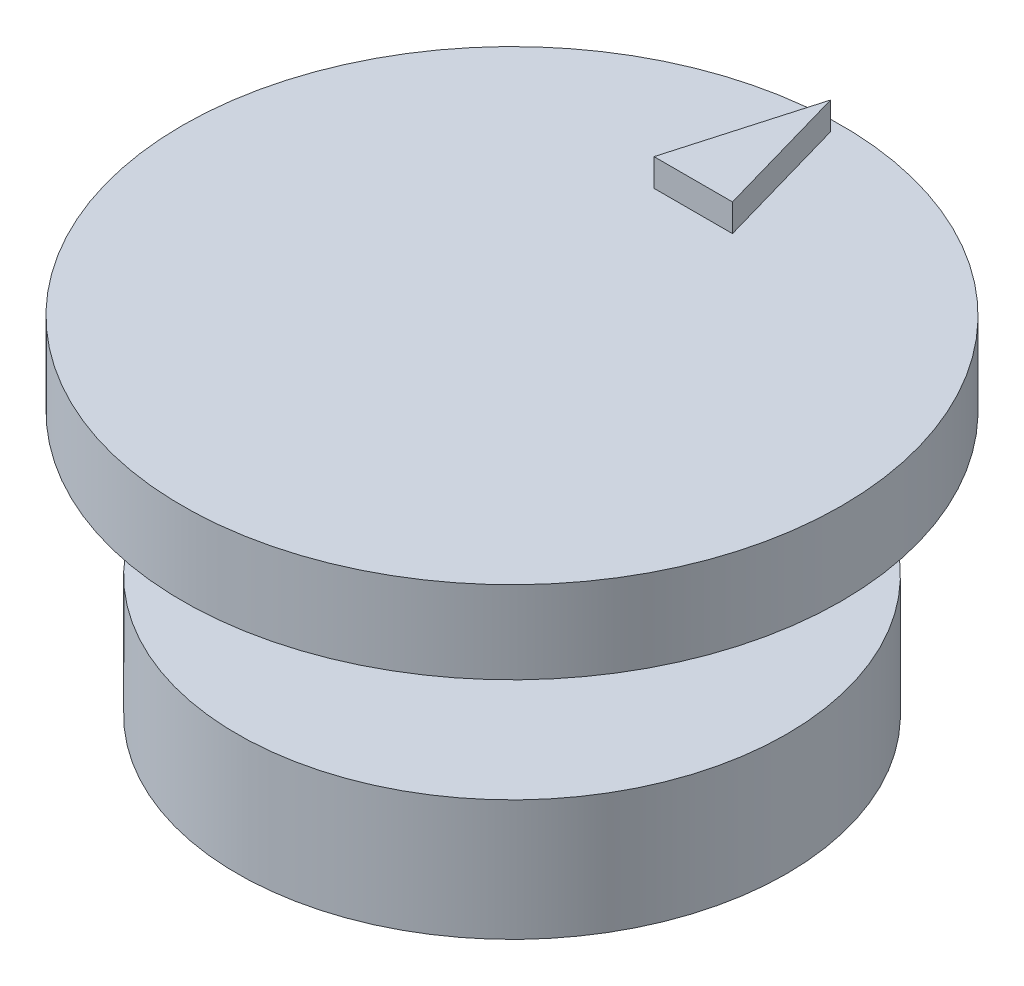
ISO-10303-21;
HEADER;
FILE_DESCRIPTION(('STEP AP214'),'2;1');
FILE_NAME('part.step','',(''),(''),'','','');
FILE_SCHEMA(('AUTOMOTIVE_DESIGN { 1 0 10303 214 1 1 1 1 }'));
ENDSEC;
DATA;
#1=APPLICATION_CONTEXT('core data for automotive mechanical design processes');
#2=APPLICATION_PROTOCOL_DEFINITION('international standard','automotive_design',2000,#1);
#3=PRODUCT_CONTEXT('',#1,'mechanical');
#4=PRODUCT('Part','Part','',(#3));
#5=PRODUCT_RELATED_PRODUCT_CATEGORY('part','',(#4));
#6=PRODUCT_DEFINITION_FORMATION('','',#4);
#7=PRODUCT_DEFINITION_CONTEXT('part definition',#1,'design');
#8=PRODUCT_DEFINITION('design','',#6,#7);
#9=PRODUCT_DEFINITION_SHAPE('','',#8);
#10=(LENGTH_UNIT() NAMED_UNIT(*) SI_UNIT(.MILLI.,.METRE.));
#11=(NAMED_UNIT(*) PLANE_ANGLE_UNIT() SI_UNIT($,.RADIAN.));
#12=(NAMED_UNIT(*) SI_UNIT($,.STERADIAN.) SOLID_ANGLE_UNIT());
#13=UNCERTAINTY_MEASURE_WITH_UNIT(LENGTH_MEASURE(1.E-05),#10,'distance_accuracy_value','');
#14=(GEOMETRIC_REPRESENTATION_CONTEXT(3) GLOBAL_UNCERTAINTY_ASSIGNED_CONTEXT((#13)) GLOBAL_UNIT_ASSIGNED_CONTEXT((#10,
#11,#12)) REPRESENTATION_CONTEXT('',''));
#15=CARTESIAN_POINT('',(0.,0.,0.));
#16=DIRECTION('',(0.,0.,1.));
#17=DIRECTION('',(1.,0.,0.));
#18=AXIS2_PLACEMENT_3D('',#15,#16,#17);
#19=CARTESIAN_POINT('',(0.,-36.8930584239754,0.));
#20=DIRECTION('',(0.,1.,0.));
#21=DIRECTION('',(-1.,0.,0.));
#22=AXIS2_PLACEMENT_3D('',#19,#20,#21);
#23=PLANE('',#22);
#24=CARTESIAN_POINT('',(0.,-36.8930584239754,0.));
#25=DIRECTION('',(0.,1.,0.));
#26=DIRECTION('',(-1.,0.,0.));
#27=AXIS2_PLACEMENT_3D('',#24,#25,#26);
#28=CIRCLE('',#27,12.7);
#29=CARTESIAN_POINT('',(-2.4106114433135,-36.8930584239754,-12.4691199556892));
#30=VERTEX_POINT('',#29);
#31=CARTESIAN_POINT('',(2.4106114433135,-36.8930584239754,-12.4691199556892));
#32=VERTEX_POINT('',#31);
#33=EDGE_CURVE('E137',#30,#32,#28,.T.);
#34=ORIENTED_EDGE('',*,*,#33,.F.);
#35=CARTESIAN_POINT('',(0.,-36.8930584239754,-9.85491099897473));
#36=DIRECTION('',(0.,1.,0.));
#37=DIRECTION('',(-1.,0.,0.));
#38=AXIS2_PLACEMENT_3D('',#35,#36,#37);
#39=CIRCLE('',#38,3.556);
#40=EDGE_CURVE('E11',#30,#32,#39,.T.);
#41=ORIENTED_EDGE('',*,*,#40,.T.);
#42=EDGE_LOOP('',(#34,#41));
#43=FACE_BOUND('',#42,.T.);
#44=ADVANCED_FACE('F35',(#43),#23,.F.);
#45=CARTESIAN_POINT('',(15.24,-20.8910584239754,0.));
#46=DIRECTION('',(0.,-1.,0.));
#47=DIRECTION('',(1.,0.,0.));
#48=AXIS2_PLACEMENT_3D('',#45,#46,#47);
#49=PLANE('',#48);
#50=CARTESIAN_POINT('',(0.,-20.8910584239754,0.));
#51=DIRECTION('',(0.,1.,0.));
#52=DIRECTION('',(-1.,0.,0.));
#53=AXIS2_PLACEMENT_3D('',#50,#51,#52);
#54=CIRCLE('',#53,15.24);
#55=CARTESIAN_POINT('',(-15.24,-20.8910584239754,0.));
#56=VERTEX_POINT('',#55);
#57=EDGE_CURVE('E111',#56,#56,#54,.T.);
#58=ORIENTED_EDGE('',*,*,#57,.T.);
#59=EDGE_LOOP('',(#58));
#60=FACE_BOUND('',#59,.T.);
#61=DIRECTION('',(-0.274670324174725,0.,-0.961538461538461));
#62=VECTOR('',#61,1.);
#63=CARTESIAN_POINT('',(1.81392282084988,-20.8910584239754,-8.382));
#64=LINE('',#63,#62);
#65=CARTESIAN_POINT('',(1.81392282084988,-20.8910584239754,-8.382));
#66=VERTEX_POINT('',#65);
#67=CARTESIAN_POINT('',(0.,-20.8910584239754,-14.732));
#68=VERTEX_POINT('',#67);
#69=EDGE_CURVE('E110',#66,#68,#64,.T.);
#70=ORIENTED_EDGE('',*,*,#69,.F.);
#71=DIRECTION('',(1.,0.,0.));
#72=VECTOR('',#71,1.);
#73=CARTESIAN_POINT('',(-1.81392282084988,-20.8910584239754,-8.382));
#74=LINE('',#73,#72);
#75=CARTESIAN_POINT('',(-1.81392282084988,-20.8910584239754,-8.382));
#76=VERTEX_POINT('',#75);
#77=EDGE_CURVE('E107',#76,#66,#74,.T.);
#78=ORIENTED_EDGE('',*,*,#77,.F.);
#79=DIRECTION('',(-0.274670324174725,0.,0.961538461538461));
#80=VECTOR('',#79,1.);
#81=CARTESIAN_POINT('',(0.,-20.8910584239754,-14.732));
#82=LINE('',#81,#80);
#83=EDGE_CURVE('E185',#68,#76,#82,.T.);
#84=ORIENTED_EDGE('',*,*,#83,.F.);
#85=EDGE_LOOP('',(#70,#78,#84));
#86=FACE_BOUND('',#85,.T.);
#87=ADVANCED_FACE('F157',(#60,#86),#49,.F.);
#88=CARTESIAN_POINT('',(0.,-20.8910584239754,0.));
#89=DIRECTION('',(0.,1.,0.));
#90=DIRECTION('',(-1.,0.,0.));
#91=AXIS2_PLACEMENT_3D('',#88,#89,#90);
#92=CYLINDRICAL_SURFACE('',#91,12.7);
#93=CARTESIAN_POINT('',(0.,-31.3050584239754,0.));
#94=DIRECTION('',(0.,1.,0.));
#95=DIRECTION('',(-1.,0.,0.));
#96=AXIS2_PLACEMENT_3D('',#93,#94,#95);
#97=CIRCLE('',#96,12.7);
#98=CARTESIAN_POINT('',(-12.7,-31.3050584239754,0.));
#99=VERTEX_POINT('',#98);
#100=EDGE_CURVE('E134',#99,#99,#97,.T.);
#101=ORIENTED_EDGE('',*,*,#100,.F.);
#102=EDGE_LOOP('',(#101));
#103=FACE_BOUND('',#102,.T.);
#104=EDGE_CURVE('E138',#32,#30,#28,.T.);
#105=ORIENTED_EDGE('',*,*,#104,.T.);
#106=ORIENTED_EDGE('',*,*,#33,.T.);
#107=EDGE_LOOP('',(#105,#106));
#108=FACE_BOUND('',#107,.T.);
#109=ADVANCED_FACE('F167',(#103,#108),#92,.T.);
#110=CARTESIAN_POINT('',(12.7,-31.3050584239754,0.));
#111=DIRECTION('',(0.,-1.,0.));
#112=DIRECTION('',(1.,0.,0.));
#113=AXIS2_PLACEMENT_3D('',#110,#111,#112);
#114=PLANE('',#113);
#115=CARTESIAN_POINT('',(0.,-31.3050584239754,0.));
#116=DIRECTION('',(0.,1.,0.));
#117=DIRECTION('',(-1.,0.,0.));
#118=AXIS2_PLACEMENT_3D('',#115,#116,#117);
#119=CIRCLE('',#118,3.175);
#120=CARTESIAN_POINT('',(-3.175,-31.3050584239754,0.));
#121=VERTEX_POINT('',#120);
#122=EDGE_CURVE('E131',#121,#121,#119,.T.);
#123=ORIENTED_EDGE('',*,*,#122,.F.);
#124=EDGE_LOOP('',(#123));
#125=FACE_BOUND('',#124,.T.);
#126=ORIENTED_EDGE('',*,*,#100,.T.);
#127=EDGE_LOOP('',(#126));
#128=FACE_BOUND('',#127,.T.);
#129=ADVANCED_FACE('F201',(#125,#128),#114,.F.);
#130=CARTESIAN_POINT('',(0.,-20.8910584239754,0.));
#131=DIRECTION('',(0.,1.,0.));
#132=DIRECTION('',(-1.,0.,0.));
#133=AXIS2_PLACEMENT_3D('',#130,#131,#132);
#134=CYLINDRICAL_SURFACE('',#133,3.175);
#135=CARTESIAN_POINT('',(0.,-26.2250584239754,0.));
#136=DIRECTION('',(0.,1.,0.));
#137=DIRECTION('',(-1.,0.,0.));
#138=AXIS2_PLACEMENT_3D('',#135,#136,#137);
#139=CIRCLE('',#138,3.175);
#140=CARTESIAN_POINT('',(-3.175,-26.2250584239754,0.));
#141=VERTEX_POINT('',#140);
#142=EDGE_CURVE('E128',#141,#141,#139,.T.);
#143=ORIENTED_EDGE('',*,*,#142,.F.);
#144=EDGE_LOOP('',(#143));
#145=FACE_BOUND('',#144,.T.);
#146=ORIENTED_EDGE('',*,*,#122,.T.);
#147=EDGE_LOOP('',(#146));
#148=FACE_BOUND('',#147,.T.);
#149=ADVANCED_FACE('F227',(#145,#148),#134,.T.);
#150=CARTESIAN_POINT('',(3.175,-26.2250584239754,0.));
#151=DIRECTION('',(0.,1.,0.));
#152=DIRECTION('',(-1.,0.,0.));
#153=AXIS2_PLACEMENT_3D('',#150,#151,#152);
#154=PLANE('',#153);
#155=CARTESIAN_POINT('',(0.,-26.2250584239754,0.));
#156=DIRECTION('',(0.,1.,0.));
#157=DIRECTION('',(-1.,0.,0.));
#158=AXIS2_PLACEMENT_3D('',#155,#156,#157);
#159=CIRCLE('',#158,12.7);
#160=CARTESIAN_POINT('',(-12.7,-26.2250584239754,0.));
#161=VERTEX_POINT('',#160);
#162=EDGE_CURVE('E125',#161,#161,#159,.T.);
#163=ORIENTED_EDGE('',*,*,#162,.F.);
#164=EDGE_LOOP('',(#163));
#165=FACE_BOUND('',#164,.T.);
#166=ORIENTED_EDGE('',*,*,#142,.T.);
#167=EDGE_LOOP('',(#166));
#168=FACE_BOUND('',#167,.T.);
#169=ADVANCED_FACE('F221',(#165,#168),#154,.F.);
#170=CARTESIAN_POINT('',(0.,-20.8910584239754,0.));
#171=DIRECTION('',(0.,1.,0.));
#172=DIRECTION('',(-1.,0.,0.));
#173=AXIS2_PLACEMENT_3D('',#170,#171,#172);
#174=CYLINDRICAL_SURFACE('',#173,12.7);
#175=CARTESIAN_POINT('',(0.,-24.7010584239754,0.));
#176=DIRECTION('',(0.,1.,0.));
#177=DIRECTION('',(-1.,0.,0.));
#178=AXIS2_PLACEMENT_3D('',#175,#176,#177);
#179=CIRCLE('',#178,12.7);
#180=CARTESIAN_POINT('',(-12.7,-24.7010584239754,0.));
#181=VERTEX_POINT('',#180);
#182=EDGE_CURVE('E122',#181,#181,#179,.T.);
#183=ORIENTED_EDGE('',*,*,#182,.F.);
#184=EDGE_LOOP('',(#183));
#185=FACE_BOUND('',#184,.T.);
#186=ORIENTED_EDGE('',*,*,#162,.T.);
#187=EDGE_LOOP('',(#186));
#188=FACE_BOUND('',#187,.T.);
#189=ADVANCED_FACE('F215',(#185,#188),#174,.T.);
#190=CARTESIAN_POINT('',(12.7,-24.7010584239754,0.));
#191=DIRECTION('',(0.,1.,0.));
#192=DIRECTION('',(-1.,0.,0.));
#193=AXIS2_PLACEMENT_3D('',#190,#191,#192);
#194=PLANE('',#193);
#195=CARTESIAN_POINT('',(0.,-24.7010584239754,0.));
#196=DIRECTION('',(0.,1.,0.));
#197=DIRECTION('',(-1.,0.,0.));
#198=AXIS2_PLACEMENT_3D('',#195,#196,#197);
#199=CIRCLE('',#198,15.24);
#200=CARTESIAN_POINT('',(-15.24,-24.7010584239754,0.));
#201=VERTEX_POINT('',#200);
#202=EDGE_CURVE('E114',#201,#201,#199,.T.);
#203=ORIENTED_EDGE('',*,*,#202,.F.);
#204=EDGE_LOOP('',(#203));
#205=FACE_BOUND('',#204,.T.);
#206=ORIENTED_EDGE('',*,*,#182,.T.);
#207=EDGE_LOOP('',(#206));
#208=FACE_BOUND('',#207,.T.);
#209=ADVANCED_FACE('F209',(#205,#208),#194,.F.);
#210=CARTESIAN_POINT('',(0.,-20.8910584239754,0.));
#211=DIRECTION('',(0.,1.,0.));
#212=DIRECTION('',(-1.,0.,0.));
#213=AXIS2_PLACEMENT_3D('',#210,#211,#212);
#214=CYLINDRICAL_SURFACE('',#213,15.24);
#215=ORIENTED_EDGE('',*,*,#57,.F.);
#216=EDGE_LOOP('',(#215));
#217=FACE_BOUND('',#216,.T.);
#218=ORIENTED_EDGE('',*,*,#202,.T.);
#219=EDGE_LOOP('',(#218));
#220=FACE_BOUND('',#219,.T.);
#221=ADVANCED_FACE('F206',(#217,#220),#214,.T.);
#222=CARTESIAN_POINT('',(1.81392282084988,-19.6210584239754,-8.382));
#223=DIRECTION('',(-0.961538461538461,0.,0.274670324174725));
#224=DIRECTION('',(0.274670324174725,0.,0.961538461538462));
#225=AXIS2_PLACEMENT_3D('',#222,#223,#224);
#226=PLANE('',#225);
#227=ORIENTED_EDGE('',*,*,#69,.T.);
#228=DIRECTION('',(0.,-1.,0.));
#229=VECTOR('',#228,1.);
#230=CARTESIAN_POINT('',(0.,-19.6210584239754,-14.732));
#231=LINE('',#230,#229);
#232=CARTESIAN_POINT('',(0.,-19.6210584239754,-14.732));
#233=VERTEX_POINT('',#232);
#234=EDGE_CURVE('E93',#233,#68,#231,.T.);
#235=ORIENTED_EDGE('',*,*,#234,.F.);
#236=DIRECTION('',(-0.274670324174725,0.,-0.961538461538461));
#237=VECTOR('',#236,1.);
#238=CARTESIAN_POINT('',(1.81392282084988,-19.6210584239754,-8.382));
#239=LINE('',#238,#237);
#240=CARTESIAN_POINT('',(1.81392282084988,-19.6210584239754,-8.382));
#241=VERTEX_POINT('',#240);
#242=EDGE_CURVE('E100',#241,#233,#239,.T.);
#243=ORIENTED_EDGE('',*,*,#242,.F.);
#244=DIRECTION('',(0.,-1.,0.));
#245=VECTOR('',#244,1.);
#246=CARTESIAN_POINT('',(1.81392282084988,-19.6210584239754,-8.382));
#247=LINE('',#246,#245);
#248=EDGE_CURVE('E116',#241,#66,#247,.T.);
#249=ORIENTED_EDGE('',*,*,#248,.T.);
#250=EDGE_LOOP('',(#227,#235,#243,#249));
#251=FACE_BOUND('',#250,.T.);
#252=ADVANCED_FACE('F109',(#251),#226,.F.);
#253=CARTESIAN_POINT('',(0.,-19.6210584239754,-14.732));
#254=DIRECTION('',(0.961538461538461,0.,0.274670324174725));
#255=DIRECTION('',(0.274670324174725,0.,-0.961538461538462));
#256=AXIS2_PLACEMENT_3D('',#253,#254,#255);
#257=PLANE('',#256);
#258=ORIENTED_EDGE('',*,*,#83,.T.);
#259=DIRECTION('',(0.,-1.,0.));
#260=VECTOR('',#259,1.);
#261=CARTESIAN_POINT('',(-1.81392282084988,-19.6210584239754,-8.382));
#262=LINE('',#261,#260);
#263=CARTESIAN_POINT('',(-1.81392282084988,-19.6210584239754,-8.382));
#264=VERTEX_POINT('',#263);
#265=EDGE_CURVE('E96',#264,#76,#262,.T.);
#266=ORIENTED_EDGE('',*,*,#265,.F.);
#267=DIRECTION('',(-0.274670324174725,0.,0.961538461538461));
#268=VECTOR('',#267,1.);
#269=CARTESIAN_POINT('',(0.,-19.6210584239754,-14.732));
#270=LINE('',#269,#268);
#271=EDGE_CURVE('E88',#233,#264,#270,.T.);
#272=ORIENTED_EDGE('',*,*,#271,.F.);
#273=ORIENTED_EDGE('',*,*,#234,.T.);
#274=EDGE_LOOP('',(#258,#266,#272,#273));
#275=FACE_BOUND('',#274,.T.);
#276=ADVANCED_FACE('F91',(#275),#257,.F.);
#277=CARTESIAN_POINT('',(-1.81392282084988,-19.6210584239754,-8.382));
#278=DIRECTION('',(0.,0.,-1.));
#279=DIRECTION('',(-1.,0.,0.));
#280=AXIS2_PLACEMENT_3D('',#277,#278,#279);
#281=PLANE('',#280);
#282=ORIENTED_EDGE('',*,*,#77,.T.);
#283=ORIENTED_EDGE('',*,*,#248,.F.);
#284=DIRECTION('',(1.,0.,0.));
#285=VECTOR('',#284,1.);
#286=CARTESIAN_POINT('',(-1.81392282084988,-19.6210584239754,-8.382));
#287=LINE('',#286,#285);
#288=EDGE_CURVE('E99',#264,#241,#287,.T.);
#289=ORIENTED_EDGE('',*,*,#288,.F.);
#290=ORIENTED_EDGE('',*,*,#265,.T.);
#291=EDGE_LOOP('',(#282,#283,#289,#290));
#292=FACE_BOUND('',#291,.T.);
#293=ADVANCED_FACE('F192',(#292),#281,.F.);
#294=CARTESIAN_POINT('',(0.,-19.6210584239754,0.));
#295=DIRECTION('',(0.,-1.,0.));
#296=DIRECTION('',(0.,0.,-1.));
#297=AXIS2_PLACEMENT_3D('',#294,#295,#296);
#298=PLANE('',#297);
#299=ORIENTED_EDGE('',*,*,#242,.T.);
#300=ORIENTED_EDGE('',*,*,#271,.T.);
#301=ORIENTED_EDGE('',*,*,#288,.T.);
#302=EDGE_LOOP('',(#299,#300,#301));
#303=FACE_BOUND('',#302,.T.);
#304=ADVANCED_FACE('F103',(#303),#298,.F.);
#305=CARTESIAN_POINT('',(0.,-39.4330584239754,-9.85491099897473));
#306=DIRECTION('',(0.,1.,0.));
#307=DIRECTION('',(-1.,0.,0.));
#308=AXIS2_PLACEMENT_3D('',#305,#306,#307);
#309=CYLINDRICAL_SURFACE('',#308,2.286);
#310=CARTESIAN_POINT('',(0.,-38.1630584239754,-9.85491099897473));
#311=DIRECTION('',(0.,1.,0.));
#312=DIRECTION('',(-1.,0.,0.));
#313=AXIS2_PLACEMENT_3D('',#310,#311,#312);
#314=CIRCLE('',#313,2.286);
#315=CARTESIAN_POINT('',(1.54967878498725,-38.1630584239754,-11.5354738997197));
#316=VERTEX_POINT('',#315);
#317=CARTESIAN_POINT('',(-1.54967878498725,-38.1630584239754,-11.5354738997197));
#318=VERTEX_POINT('',#317);
#319=EDGE_CURVE('E141',#316,#318,#314,.F.);
#320=ORIENTED_EDGE('',*,*,#319,.T.);
#321=CARTESIAN_POINT('',(-1.94507817695019,-38.016289879887,-11.055938428117));
#322=CARTESIAN_POINT('',(-1.61999578770745,-36.3230745492677,-11.5824132160229));
#323=CARTESIAN_POINT('',(-3.17378663836872,-36.8930584239754,-12.297035348982));
#324=CARTESIAN_POINT('',(-1.92726231286968,-38.035566452302,-11.0848061155008));
#325=CARTESIAN_POINT('',(-1.62663265770544,-36.3562459334707,-11.5543796359865));
#326=CARTESIAN_POINT('',(-3.13512998523857,-36.8930584239754,-12.3070140212924));
#327=CARTESIAN_POINT('',(-1.90852441824263,-38.0525133600217,-11.1136999631071));
#328=CARTESIAN_POINT('',(-1.63189143050012,-36.391459050649,-11.5318529151384));
#329=CARTESIAN_POINT('',(-3.09536394091131,-36.8930584239754,-12.3170812688952));
#330=CARTESIAN_POINT('',(-1.86935645343757,-38.0822092048636,-11.1711560447141));
#331=CARTESIAN_POINT('',(-1.63879487488696,-36.4627447281025,-11.4974254770567));
#332=CARTESIAN_POINT('',(-3.01399825191309,-36.8930584239754,-12.3372427663437));
#333=CARTESIAN_POINT('',(-1.84892943793623,-38.094965521235,-11.1997187752566));
#334=CARTESIAN_POINT('',(-1.64053295592431,-36.4987746910067,-11.4852540715753));
#335=CARTESIAN_POINT('',(-2.97240197822067,-36.8930584239754,-12.3473369368265));
#336=CARTESIAN_POINT('',(-1.78561820581129,-38.1275332622962,-11.2839898559959));
#337=CARTESIAN_POINT('',(-1.63971877715429,-36.6032397288013,-11.4626467503882));
#338=CARTESIAN_POINT('',(-2.84598292553202,-36.8930584239754,-12.3773110591545));
#339=CARTESIAN_POINT('',(-1.74038426918346,-38.1419664965945,-11.3388032983194));
#340=CARTESIAN_POINT('',(-1.63180976870696,-36.671399819268,-11.4638809648361));
#341=CARTESIAN_POINT('',(-2.75883487233056,-36.8930584239754,-12.3970637610194));
#342=CARTESIAN_POINT('',(-1.62417663213297,-38.1637727820004,-11.4667957671252));
#343=CARTESIAN_POINT('',(-1.59311480415834,-36.8197580213631,-11.4935837251689));
#344=CARTESIAN_POINT('',(-2.54215500613981,-36.8930584239754,-12.4436489744862));
#345=CARTESIAN_POINT('',(-1.55045290641865,-38.1655094849074,-11.5378374044639));
#346=CARTESIAN_POINT('',(-1.55508090896377,-36.896348029813,-11.531629523399));
#347=CARTESIAN_POINT('',(-2.41039852145943,-36.8930584239754,-12.469908093997));
#348=CARTESIAN_POINT('',(-1.3941913032622,-38.155304696386,-11.6694486802566));
#349=CARTESIAN_POINT('',(-1.45127355772696,-37.021066825438,-11.6235817956311));
#350=CARTESIAN_POINT('',(-2.14076630225403,-36.8930584239754,-12.5190274519587));
#351=CARTESIAN_POINT('',(-1.31161493969475,-38.1433010879129,-11.7299693259668));
#352=CARTESIAN_POINT('',(-1.38635563050011,-37.0709799065067,-11.677126902171));
#353=CARTESIAN_POINT('',(-2.00286550842932,-36.8930584239754,-12.5418717229627));
#354=CARTESIAN_POINT('',(-1.13645712370305,-38.1117055001885,-11.8412178477904));
#355=CARTESIAN_POINT('',(-1.23334738843909,-37.1499350118153,-11.7850214012327));
#356=CARTESIAN_POINT('',(-1.71782236621717,-36.8930584239754,-12.5841408691187));
#357=CARTESIAN_POINT('',(-1.04362165123918,-38.0918544731533,-11.8915117507908));
#358=CARTESIAN_POINT('',(-1.14459105697362,-37.1795161047937,-11.839932906394));
#359=CARTESIAN_POINT('',(-1.57052619299383,-36.8930584239754,-12.6034119666155));
#360=CARTESIAN_POINT('',(-0.852023527992594,-38.0510280011601,-11.9788046121638));
#361=CARTESIAN_POINT('',(-0.951428319062742,-37.2227885955054,-11.938916954579));
#362=CARTESIAN_POINT('',(-1.27224060381861,-36.8930584239754,-12.6370055606747));
#363=CARTESIAN_POINT('',(-0.753263428800153,-38.0300530406621,-12.0158092466));
#364=CARTESIAN_POINT('',(-0.846622010071318,-37.2371617806065,-11.9837702286955));
#365=CARTESIAN_POINT('',(-1.12125279412754,-36.8930584239754,-12.6513301698622));
#366=CARTESIAN_POINT('',(-0.590425790442381,-37.9999806164591,-12.064292133831));
#367=CARTESIAN_POINT('',(-0.66874446407701,-37.2530486564494,-12.0435328367706));
#368=CARTESIAN_POINT('',(-0.875339512376922,-36.8930584239754,-12.6701450636663));
#369=CARTESIAN_POINT('',(-0.527721324041513,-37.9894283801407,-12.0801066488879));
#370=CARTESIAN_POINT('',(-0.599278548638481,-37.25743438858,-12.0633741026098));
#371=CARTESIAN_POINT('',(-0.781337065594528,-36.8930584239754,-12.6762957287087));
#372=CARTESIAN_POINT('',(-0.401037400708828,-37.9712227164759,-12.1063872416679));
#373=CARTESIAN_POINT('',(-0.457604991504023,-37.2640003738694,-12.0965216064425));
#374=CARTESIAN_POINT('',(-0.592405895839446,-36.8930584239754,-12.6865280549896));
#375=CARTESIAN_POINT('',(-0.33705842771908,-37.9635682101149,-12.1168553107309));
#376=CARTESIAN_POINT('',(-0.38517028262797,-37.2662124617989,-12.1099465392535));
#377=CARTESIAN_POINT('',(-0.497477531179832,-36.8930584239754,-12.6906104865587));
#378=CARTESIAN_POINT('',(-0.208352627645304,-37.9520619664477,-12.1323180487469));
#379=CARTESIAN_POINT('',(-0.238822219579095,-37.2692661622095,-12.1297793349573));
#380=CARTESIAN_POINT('',(-0.307085419683226,-36.8930584239754,-12.6966437655955));
#381=CARTESIAN_POINT('',(-0.143626457288623,-37.9482071139398,-12.1373172018405));
#382=CARTESIAN_POINT('',(-0.164653536163961,-37.270121421184,-12.1362646449444));
#383=CARTESIAN_POINT('',(-0.211622176068336,-36.8930584239754,-12.6985963593821));
#384=CARTESIAN_POINT('',(-0.0139408893702848,-37.9447655585574,-12.1417888244288));
#385=CARTESIAN_POINT('',(-0.0160685249292508,-37.2708902312534,-12.142042429309));
#386=CARTESIAN_POINT('',(-0.0205164788129183,-36.8930584239754,-12.7003428240827));
#387=CARTESIAN_POINT('',(0.0510184791692751,-37.9451783417976,-12.1412619593362));
#388=CARTESIAN_POINT('',(0.058619006475782,-37.270806694143,-12.1413569715574));
#389=CARTESIAN_POINT('',(0.0751259518642213,-36.8930584239754,-12.7001369549069));
#390=CARTESIAN_POINT('',(0.175354048097755,-37.9500145352915,-12.1349554333437));
#391=CARTESIAN_POINT('',(0.200948079905392,-37.2697047280169,-12.133214601666));
#392=CARTESIAN_POINT('',(0.258422029074957,-36.8930584239754,-12.6976740770736));
#393=CARTESIAN_POINT('',(0.23475765375788,-37.954111508917,-12.1296032231178));
#394=CARTESIAN_POINT('',(0.268901903543945,-37.2687588355178,-12.1262833242322));
#395=CARTESIAN_POINT('',(0.346097334238351,-36.8930584239754,-12.6955839825023));
#396=CARTESIAN_POINT('',(0.352852112313129,-37.965428507056,-12.1143006847925));
#397=CARTESIAN_POINT('',(0.403006819696522,-37.2656678849858,-12.1066899339339));
#398=CARTESIAN_POINT('',(0.52091030323917,-36.8930584239754,-12.6896144166636));
#399=CARTESIAN_POINT('',(0.411542691578279,-37.9726496938715,-12.1043486453231));
#400=CARTESIAN_POINT('',(0.469354402067744,-37.2635114700602,-12.0939661248555));
#401=CARTESIAN_POINT('',(0.608047754729751,-36.8930584239754,-12.6857342794103));
#402=CARTESIAN_POINT('',(0.586172906974669,-37.9980053612971,-12.0676789497586));
#403=CARTESIAN_POINT('',(0.665310446379463,-37.2542530282019,-12.0475058528943));
#404=CARTESIAN_POINT('',(0.868563527804786,-36.8930584239754,-12.6714571510114));
#405=CARTESIAN_POINT('',(0.700526649175253,-38.0198234542282,-12.0341552911853));
#406=CARTESIAN_POINT('',(0.791118265493692,-37.2442782531025,-12.0052893537066));
#407=CARTESIAN_POINT('',(1.04083389957888,-36.8930584239754,-12.6584264438622));
#408=CARTESIAN_POINT('',(0.925790269898953,-38.0662818997118,-11.9486390267705));
#409=CARTESIAN_POINT('',(1.02800326087546,-37.2091632529046,-11.9039563276283));
#410=CARTESIAN_POINT('',(1.38601341639163,-36.8930584239754,-12.6253715977107));
#411=CARTESIAN_POINT('',(1.03649074955472,-38.0909877448334,-11.8961174901084));
#412=CARTESIAN_POINT('',(1.13936304340168,-37.1828782641934,-11.8432440087393));
#413=CARTESIAN_POINT('',(1.55878369724801,-36.8930584239754,-12.6051474835494));
#414=CARTESIAN_POINT('',(1.24822182706422,-38.1329651689904,-11.7739157392289));
#415=CARTESIAN_POINT('',(1.3346385779643,-37.1045620961288,-11.7172868342598));
#416=CARTESIAN_POINT('',(1.89815654991444,-36.8930584239754,-12.5585081598603));
#417=CARTESIAN_POINT('',(1.34928858367093,-38.1502654727756,-11.7043035020459));
#418=CARTESIAN_POINT('',(1.41869230426781,-37.0509004031857,-11.6510000356354));
#419=CARTESIAN_POINT('',(2.06478061906613,-36.8930584239754,-12.5321174969335));
#420=CARTESIAN_POINT('',(1.50993549289782,-38.1638508936124,-11.5733560673344));
#421=CARTESIAN_POINT('',(1.52936749657738,-36.9318380876448,-11.5551415067385));
#422=CARTESIAN_POINT('',(2.33978374412294,-36.8930584239754,-12.4831262297988));
#423=CARTESIAN_POINT('',(1.57267293093564,-38.1649837968624,-11.5161299564677));
#424=CARTESIAN_POINT('',(1.56583840792498,-36.8732210197985,-11.5201185757782));
#425=CARTESIAN_POINT('',(2.45022524364961,-36.8930584239754,-12.4618815280841));
#426=CARTESIAN_POINT('',(1.66172130694142,-38.1565578612134,-11.4253542545891));
#427=CARTESIAN_POINT('',(1.60506196467927,-36.7735491396636,-11.4846695080542));
#428=CARTESIAN_POINT('',(2.61221557320304,-36.8930584239754,-12.4285718901537));
#429=CARTESIAN_POINT('',(1.69064667040653,-38.1520303356207,-11.3941636195854));
#430=CARTESIAN_POINT('',(1.6156357250693,-36.7373951331885,-11.4756752617127));
#431=CARTESIAN_POINT('',(2.66576807857034,-36.8930584239754,-12.4171889436037));
#432=CARTESIAN_POINT('',(1.74659340435301,-38.1388472843436,-11.3303830253722));
#433=CARTESIAN_POINT('',(1.63144936029451,-36.6613469593191,-11.4657866742227));
#434=CARTESIAN_POINT('',(2.77130346692779,-36.8930584239754,-12.3940636055124));
#435=CARTESIAN_POINT('',(1.77361176145157,-38.1301853862001,-11.2977909769157));
#436=CARTESIAN_POINT('',(1.63653715522174,-36.6213200013206,-11.4651275171172));
#437=CARTESIAN_POINT('',(2.82328379469776,-36.8930584239754,-12.382320685366));
#438=CARTESIAN_POINT('',(1.79956630727021,-38.1191043006281,-11.2646475366788));
#439=CARTESIAN_POINT('',(1.63879155319486,-36.5805280380012,-11.4698808003104));
#440=CARTESIAN_POINT('',(2.87428938605186,-36.8930584239754,-12.3704672719033));
#441=(BOUNDED_SURFACE() B_SPLINE_SURFACE(3,2,((#321,#322,#323),(#324,#325,#326),(#327,#328,
#329),(#330,#331,#332),(#333,#334,#335),(#336,#337,#338),(#339,#340,#341),(#342,#343,#344),
(#345,#346,#347),(#348,#349,#350),(#351,#352,#353),(#354,#355,#356),(#357,#358,#359),(#360,#361,
#362),(#363,#364,#365),(#366,#367,#368),(#369,#370,#371),(#372,#373,#374),(#375,#376,#377),
(#378,#379,#380),(#381,#382,#383),(#384,#385,#386),(#387,#388,#389),(#390,#391,#392),(#393,#394,
#395),(#396,#397,#398),(#399,#400,#401),(#402,#403,#404),(#405,#406,#407),(#408,#409,#410),
(#411,#412,#413),(#414,#415,#416),(#417,#418,#419),(#420,#421,#422),(#423,#424,#425),(#426,#427,
#428),(#429,#430,#431),(#432,#433,#434),(#435,#436,#437),(#438,#439,#440)),.UNSPECIFIED.,.F.,
.F.,.F.) B_SPLINE_SURFACE_WITH_KNOTS((4,2,2,2,2,2,2,2,2,2,2,2,2,2,2,2,2,2,2,4),(3,3),(0.,
0.168379207940803,0.336460305977442,0.669644517679046,1.14492736290791,1.62236737606153,
2.11709631482194,2.61161369475196,2.91470522649331,3.21768378613402,3.52041373725729,
3.8231072357259,4.10136662930695,4.37972963295568,4.93712240487676,5.51140755031774,
6.08344450661404,6.47839237523295,6.67716036688079,6.8762357211155),(0.,1.),
.UNSPECIFIED.) GEOMETRIC_REPRESENTATION_ITEM() RATIONAL_B_SPLINE_SURFACE(((1.,0.575921822428839,
1.),(1.,0.583292459485149,1.),(1.,0.590804540907189,1.),(1.,0.605959552624376,1.),(1.,
0.613602227708823,1.),(1.,0.636403624473366,1.),(1.,0.65157097152543,1.),(1.,0.687431578155226,
1.),(1.,0.707722763476012,1.),(1.,0.745589248686107,1.),(1.,0.763151803981675,1.),(1.,
0.795523377292038,1.),(1.,0.810209655393189,1.),(1.,0.835715767312386,1.),(1.,0.846537251835957,
1.),(1.,0.860714001705678,1.),(1.,0.865337883261853,1.),(1.,0.873021085832718,1.),(1.,
0.876080989367764,1.),(1.,0.880600504645062,1.),(1.,0.882061427443662,1.),(1.,0.88336820718334,
1.),(1.,0.883214258578337,1.),(1.,0.881371203373464,1.),(1.,0.87980702134659,1.),(1.,
0.875334284349022,1.),(1.,0.872425229017046,1.),(1.,0.8617043388877,1.),(1.,0.851900989146072,
1.),(1.,0.826899243960927,1.),(1.,0.811546349941919,1.),(1.,0.775918976100823,1.),(1.,
0.755663998399903,1.),(1.,0.717920148988533,1.),(1.,0.701516142608414,1.),(1.,0.675829064042788,
1.),(1.,0.667056286226064,1.),(1.,0.649277220120569,1.),(1.,0.640270591722716,1.),(1.,
0.63121723544078,1.))) REPRESENTATION_ITEM('') SURFACE());
#442=CARTESIAN_POINT('',(-1.94507817695019,-38.016289879887,-11.055938428117));
#443=CARTESIAN_POINT('',(-1.92726231286968,-38.035566452302,-11.0848061155008));
#444=CARTESIAN_POINT('',(-1.90852441824263,-38.0525133600217,-11.1136999631071));
#445=CARTESIAN_POINT('',(-1.86935645343757,-38.0822092048636,-11.1711560447141));
#446=CARTESIAN_POINT('',(-1.84892943793623,-38.094965521235,-11.1997187752566));
#447=CARTESIAN_POINT('',(-1.78561820581129,-38.1275332622962,-11.2839898559959));
#448=CARTESIAN_POINT('',(-1.74038426918346,-38.1419664965945,-11.3388032983194));
#449=CARTESIAN_POINT('',(-1.62417663213297,-38.1637727820004,-11.4667957671252));
#450=CARTESIAN_POINT('',(-1.55045290641865,-38.1655094849074,-11.5378374044639));
#451=CARTESIAN_POINT('',(-1.3941913032622,-38.155304696386,-11.6694486802566));
#452=CARTESIAN_POINT('',(-1.31161493969475,-38.1433010879129,-11.7299693259668));
#453=CARTESIAN_POINT('',(-1.13645712370305,-38.1117055001885,-11.8412178477904));
#454=CARTESIAN_POINT('',(-1.04362165123918,-38.0918544731533,-11.8915117507908));
#455=CARTESIAN_POINT('',(-0.852023527992594,-38.0510280011601,-11.9788046121638));
#456=CARTESIAN_POINT('',(-0.753263428800154,-38.0300530406621,-12.0158092466));
#457=CARTESIAN_POINT('',(-0.590425790442381,-37.9999806164591,-12.064292133831));
#458=CARTESIAN_POINT('',(-0.527721324041513,-37.9894283801407,-12.0801066488879));
#459=CARTESIAN_POINT('',(-0.401037400708828,-37.9712227164759,-12.1063872416679));
#460=CARTESIAN_POINT('',(-0.33705842771908,-37.9635682101149,-12.1168553107309));
#461=CARTESIAN_POINT('',(-0.208352627645304,-37.9520619664477,-12.1323180487469));
#462=CARTESIAN_POINT('',(-0.143626457288623,-37.9482071139398,-12.1373172018405));
#463=CARTESIAN_POINT('',(-0.0139408893702848,-37.9447655585574,-12.1417888244288));
#464=CARTESIAN_POINT('',(0.051018479169275,-37.9451783417976,-12.1412619593362));
#465=CARTESIAN_POINT('',(0.175354048097755,-37.9500145352914,-12.1349554333437));
#466=CARTESIAN_POINT('',(0.234757653757881,-37.954111508917,-12.1296032231178));
#467=CARTESIAN_POINT('',(0.352852112313129,-37.965428507056,-12.1143006847925));
#468=CARTESIAN_POINT('',(0.411542691578279,-37.9726496938715,-12.1043486453231));
#469=CARTESIAN_POINT('',(0.586172906974669,-37.9980053612971,-12.0676789497586));
#470=CARTESIAN_POINT('',(0.700526649175253,-38.0198234542282,-12.0341552911853));
#471=CARTESIAN_POINT('',(0.925790269898953,-38.0662818997118,-11.9486390267705));
#472=CARTESIAN_POINT('',(1.03649074955472,-38.0909877448334,-11.8961174901084));
#473=CARTESIAN_POINT('',(1.24822182706422,-38.1329651689904,-11.7739157392289));
#474=CARTESIAN_POINT('',(1.34928858367093,-38.1502654727756,-11.7043035020459));
#475=CARTESIAN_POINT('',(1.50993549289782,-38.1638508936124,-11.5733560673344));
#476=CARTESIAN_POINT('',(1.57267293093564,-38.1649837968624,-11.5161299564677));
#477=CARTESIAN_POINT('',(1.66172130694142,-38.1565578612134,-11.4253542545891));
#478=CARTESIAN_POINT('',(1.69064667040653,-38.1520303356207,-11.3941636195854));
#479=CARTESIAN_POINT('',(1.74659340435301,-38.1388472843436,-11.3303830253722));
#480=CARTESIAN_POINT('',(1.77361176145157,-38.1301853862001,-11.2977909769157));
#481=CARTESIAN_POINT('',(1.79956630727021,-38.1191043006281,-11.2646475366788));
#482=B_SPLINE_CURVE_WITH_KNOTS('',3,(#442,#443,#444,#445,#446,#447,#448,#449,#450,#451,#452,
#453,#454,#455,#456,#457,#458,#459,#460,#461,#462,#463,#464,#465,#466,#467,#468,#469,#470,#471,
#472,#473,#474,#475,#476,#477,#478,#479,#480,#481),.UNSPECIFIED.,.F.,.F.,(4,2,2,2,2,2,2,2,2,2,2,
2,2,2,2,2,2,2,2,4),(0.,0.168379207940803,0.336460305977442,0.669644517679046,1.14492736290791,
1.62236737606153,2.11709631482194,2.61161369475196,2.91470522649331,3.21768378613402,
3.52041373725729,3.8231072357259,4.10136662930695,4.37972963295568,4.93712240487676,
5.51140755031774,6.08344450661404,6.47839237523295,6.67716036688079,6.8762357211155),.UNSPECIFIED.);
#483=EDGE_CURVE('E48',#318,#316,#482,.T.);
#484=ORIENTED_EDGE('',*,*,#483,.T.);
#485=EDGE_LOOP('',(#320,#484));
#486=FACE_BOUND('',#485,.T.);
#487=CARTESIAN_POINT('',(0.,-39.4330584239754,-9.85491099897473));
#488=DIRECTION('',(0.,-1.,0.));
#489=DIRECTION('',(1.,0.,0.));
#490=AXIS2_PLACEMENT_3D('',#487,#488,#489);
#491=CIRCLE('',#490,2.286);
#492=CARTESIAN_POINT('',(2.286,-39.4330584239754,-9.85491099897473));
#493=VERTEX_POINT('',#492);
#494=EDGE_CURVE('E172',#493,#493,#491,.T.);
#495=ORIENTED_EDGE('',*,*,#494,.F.);
#496=EDGE_LOOP('',(#495));
#497=FACE_BOUND('',#496,.T.);
#498=ADVANCED_FACE('F150',(#486,#497),#309,.T.);
#499=CARTESIAN_POINT('',(0.,-39.4330584239754,-9.85491099897473));
#500=DIRECTION('',(0.,-1.,0.));
#501=DIRECTION('',(1.,0.,0.));
#502=AXIS2_PLACEMENT_3D('',#499,#500,#501);
#503=PLANE('',#502);
#504=ORIENTED_EDGE('',*,*,#494,.T.);
#505=EDGE_LOOP('',(#504));
#506=FACE_BOUND('',#505,.T.);
#507=ADVANCED_FACE('F180',(#506),#503,.T.);
#508=CARTESIAN_POINT('',(0.,-38.1630584239754,-9.85491099897473));
#509=DIRECTION('',(0.,1.,0.));
#510=DIRECTION('',(-1.,0.,0.));
#511=AXIS2_PLACEMENT_3D('',#508,#509,#510);
#512=TOROIDAL_SURFACE('',#511,3.556,1.27);
#513=CARTESIAN_POINT('',(2.4106114433135,-38.1630584239754,-12.4691199556892));
#514=DIRECTION('',(0.735154374779091,0.,0.677899730965549));
#515=DIRECTION('',(0.677899730965549,0.,-0.735154374779091));
#516=AXIS2_PLACEMENT_3D('',#513,#514,#515);
#517=CIRCLE('',#516,1.27);
#518=EDGE_CURVE('E173',#32,#316,#517,.T.);
#519=ORIENTED_EDGE('',*,*,#518,.F.);
#520=ORIENTED_EDGE('',*,*,#40,.F.);
#521=CARTESIAN_POINT('',(-2.4106114433135,-38.1630584239754,-12.4691199556892));
#522=DIRECTION('',(-0.73515437477909,0.,0.67789973096555));
#523=DIRECTION('',(0.67789973096555,0.,0.73515437477909));
#524=AXIS2_PLACEMENT_3D('',#521,#522,#523);
#525=CIRCLE('',#524,1.27);
#526=EDGE_CURVE('E56',#318,#30,#525,.T.);
#527=ORIENTED_EDGE('',*,*,#526,.F.);
#528=ORIENTED_EDGE('',*,*,#319,.F.);
#529=EDGE_LOOP('',(#519,#520,#527,#528));
#530=FACE_BOUND('',#529,.T.);
#531=ADVANCED_FACE('F37',(#530),#512,.F.);
#532=ORIENTED_EDGE('',*,*,#526,.T.);
#533=ORIENTED_EDGE('',*,*,#104,.F.);
#534=ORIENTED_EDGE('',*,*,#518,.T.);
#535=ORIENTED_EDGE('',*,*,#483,.F.);
#536=EDGE_LOOP('',(#532,#533,#534,#535));
#537=FACE_BOUND('',#536,.T.);
#538=ADVANCED_FACE('F159',(#537),#441,.F.);
#539=CLOSED_SHELL('',(#44,#87,#109,#129,#149,#169,#189,#209,#221,#252,#276,#293,#304,#498,#507,
#531,#538));
#540=MANIFOLD_SOLID_BREP('B2',#539);
#541=ADVANCED_BREP_SHAPE_REPRESENTATION('',(#18,#540),#14);
#542=SHAPE_DEFINITION_REPRESENTATION(#9,#541);
ENDSEC;
END-ISO-10303-21;
